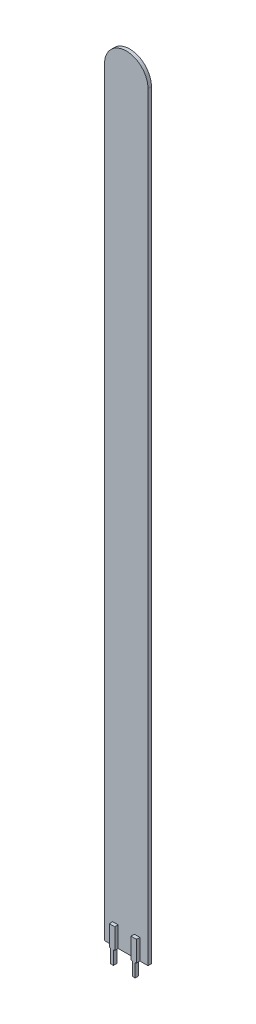
ISO-10303-21;
HEADER;
FILE_DESCRIPTION(('STEP AP214'),'2;1');
FILE_NAME('part.step','',(''),(''),'','','');
FILE_SCHEMA(('AUTOMOTIVE_DESIGN { 1 0 10303 214 1 1 1 1 }'));
ENDSEC;
DATA;
#1=APPLICATION_CONTEXT('core data for automotive mechanical design processes');
#2=APPLICATION_PROTOCOL_DEFINITION('international standard','automotive_design',2000,#1);
#3=PRODUCT_CONTEXT('',#1,'mechanical');
#4=PRODUCT('Part','Part','',(#3));
#5=PRODUCT_RELATED_PRODUCT_CATEGORY('part','',(#4));
#6=PRODUCT_DEFINITION_FORMATION('','',#4);
#7=PRODUCT_DEFINITION_CONTEXT('part definition',#1,'design');
#8=PRODUCT_DEFINITION('design','',#6,#7);
#9=PRODUCT_DEFINITION_SHAPE('','',#8);
#10=(LENGTH_UNIT() NAMED_UNIT(*) SI_UNIT(.MILLI.,.METRE.));
#11=(NAMED_UNIT(*) PLANE_ANGLE_UNIT() SI_UNIT($,.RADIAN.));
#12=(NAMED_UNIT(*) SI_UNIT($,.STERADIAN.) SOLID_ANGLE_UNIT());
#13=UNCERTAINTY_MEASURE_WITH_UNIT(LENGTH_MEASURE(1.E-05),#10,'distance_accuracy_value','');
#14=(GEOMETRIC_REPRESENTATION_CONTEXT(3) GLOBAL_UNCERTAINTY_ASSIGNED_CONTEXT((#13)) GLOBAL_UNIT_ASSIGNED_CONTEXT((#10,
#11,#12)) REPRESENTATION_CONTEXT('',''));
#15=CARTESIAN_POINT('',(0.,0.,0.));
#16=DIRECTION('',(0.,0.,1.));
#17=DIRECTION('',(1.,0.,0.));
#18=AXIS2_PLACEMENT_3D('',#15,#16,#17);
#19=CARTESIAN_POINT('',(0.,53.975,0.25));
#20=DIRECTION('',(0.,0.,1.));
#21=DIRECTION('',(1.,0.,0.));
#22=AXIS2_PLACEMENT_3D('',#19,#20,#21);
#23=PLANE('',#22);
#24=DIRECTION('',(1.,0.,0.));
#25=VECTOR('',#24,1.);
#26=CARTESIAN_POINT('',(3.175,-57.15,0.25));
#27=LINE('',#26,#25);
#28=CARTESIAN_POINT('',(-1.1875,-57.15,0.25));
#29=VERTEX_POINT('',#28);
#30=CARTESIAN_POINT('',(1.1875,-57.15,0.25));
#31=VERTEX_POINT('',#30);
#32=EDGE_CURVE('E474',#29,#31,#27,.T.);
#33=ORIENTED_EDGE('',*,*,#32,.T.);
#34=DIRECTION('',(0.,-1.,0.));
#35=VECTOR('',#34,1.);
#36=CARTESIAN_POINT('',(1.18749999999999,0.,0.25));
#37=LINE('',#36,#35);
#38=CARTESIAN_POINT('',(1.1875,-54.15,0.25));
#39=VERTEX_POINT('',#38);
#40=EDGE_CURVE('E70',#39,#31,#37,.T.);
#41=ORIENTED_EDGE('',*,*,#40,.F.);
#42=DIRECTION('',(-1.,0.,0.));
#43=VECTOR('',#42,1.);
#44=CARTESIAN_POINT('',(0.,-54.15,0.25));
#45=LINE('',#44,#43);
#46=CARTESIAN_POINT('',(1.9875,-54.15,0.25));
#47=VERTEX_POINT('',#46);
#48=EDGE_CURVE('E65',#47,#39,#45,.T.);
#49=ORIENTED_EDGE('',*,*,#48,.F.);
#50=DIRECTION('',(0.,-1.,0.));
#51=VECTOR('',#50,1.);
#52=CARTESIAN_POINT('',(1.98750000000001,0.,0.25));
#53=LINE('',#52,#51);
#54=CARTESIAN_POINT('',(1.9875,-57.15,0.25));
#55=VERTEX_POINT('',#54);
#56=EDGE_CURVE('E286',#47,#55,#53,.T.);
#57=ORIENTED_EDGE('',*,*,#56,.T.);
#58=CARTESIAN_POINT('',(3.175,-57.15,0.25));
#59=VERTEX_POINT('',#58);
#60=EDGE_CURVE('E428',#55,#59,#27,.T.);
#61=ORIENTED_EDGE('',*,*,#60,.T.);
#62=DIRECTION('',(0.,1.,0.));
#63=VECTOR('',#62,1.);
#64=CARTESIAN_POINT('',(3.175,-57.15,0.25));
#65=LINE('',#64,#63);
#66=CARTESIAN_POINT('',(3.175,53.975,0.25));
#67=VERTEX_POINT('',#66);
#68=EDGE_CURVE('E417',#59,#67,#65,.T.);
#69=ORIENTED_EDGE('',*,*,#68,.T.);
#70=CARTESIAN_POINT('',(0.,53.975,0.25));
#71=DIRECTION('',(0.,0.,1.));
#72=DIRECTION('',(1.,0.,0.));
#73=AXIS2_PLACEMENT_3D('',#70,#71,#72);
#74=CIRCLE('',#73,3.175);
#75=CARTESIAN_POINT('',(-3.175,53.975,0.25));
#76=VERTEX_POINT('',#75);
#77=EDGE_CURVE('E421',#67,#76,#74,.T.);
#78=ORIENTED_EDGE('',*,*,#77,.T.);
#79=DIRECTION('',(0.,-1.,0.));
#80=VECTOR('',#79,1.);
#81=CARTESIAN_POINT('',(-3.175,-57.15,0.25));
#82=LINE('',#81,#80);
#83=CARTESIAN_POINT('',(-3.175,-57.15,0.25));
#84=VERTEX_POINT('',#83);
#85=EDGE_CURVE('E425',#76,#84,#82,.T.);
#86=ORIENTED_EDGE('',*,*,#85,.T.);
#87=CARTESIAN_POINT('',(-1.9875,-57.15,0.25));
#88=VERTEX_POINT('',#87);
#89=EDGE_CURVE('E429',#84,#88,#27,.T.);
#90=ORIENTED_EDGE('',*,*,#89,.T.);
#91=DIRECTION('',(0.,-1.,0.));
#92=VECTOR('',#91,1.);
#93=CARTESIAN_POINT('',(-1.98750000000001,0.,0.25));
#94=LINE('',#93,#92);
#95=CARTESIAN_POINT('',(-1.9875,-54.15,0.25));
#96=VERTEX_POINT('',#95);
#97=EDGE_CURVE('E361',#96,#88,#94,.T.);
#98=ORIENTED_EDGE('',*,*,#97,.F.);
#99=DIRECTION('',(1.,0.,0.));
#100=VECTOR('',#99,1.);
#101=CARTESIAN_POINT('',(0.,-54.15,0.25));
#102=LINE('',#101,#100);
#103=CARTESIAN_POINT('',(-1.1875,-54.15,0.25));
#104=VERTEX_POINT('',#103);
#105=EDGE_CURVE('E357',#96,#104,#102,.T.);
#106=ORIENTED_EDGE('',*,*,#105,.T.);
#107=DIRECTION('',(0.,-1.,0.));
#108=VECTOR('',#107,1.);
#109=CARTESIAN_POINT('',(-1.18749999999999,0.,0.25));
#110=LINE('',#109,#108);
#111=EDGE_CURVE('E229',#104,#29,#110,.T.);
#112=ORIENTED_EDGE('',*,*,#111,.T.);
#113=EDGE_LOOP('',(#33,#41,#49,#57,#61,#69,#78,#86,#90,#98,#106,#112));
#114=FACE_BOUND('',#113,.T.);
#115=ADVANCED_FACE('F49',(#114),#23,.T.);
#116=CARTESIAN_POINT('',(3.175,-57.15,0.25));
#117=DIRECTION('',(-1.,0.,0.));
#118=DIRECTION('',(0.,0.,1.));
#119=AXIS2_PLACEMENT_3D('',#116,#117,#118);
#120=PLANE('',#119);
#121=DIRECTION('',(0.,1.,0.));
#122=VECTOR('',#121,1.);
#123=CARTESIAN_POINT('',(3.175,-57.15,-0.25));
#124=LINE('',#123,#122);
#125=CARTESIAN_POINT('',(3.175,-57.15,-0.25));
#126=VERTEX_POINT('',#125);
#127=CARTESIAN_POINT('',(3.175,53.975,-0.25));
#128=VERTEX_POINT('',#127);
#129=EDGE_CURVE('E416',#126,#128,#124,.T.);
#130=ORIENTED_EDGE('',*,*,#129,.T.);
#131=DIRECTION('',(0.,0.,-1.));
#132=VECTOR('',#131,1.);
#133=CARTESIAN_POINT('',(3.175,53.975,0.25));
#134=LINE('',#133,#132);
#135=EDGE_CURVE('E11',#67,#128,#134,.T.);
#136=ORIENTED_EDGE('',*,*,#135,.F.);
#137=ORIENTED_EDGE('',*,*,#68,.F.);
#138=DIRECTION('',(0.,0.,-1.));
#139=VECTOR('',#138,1.);
#140=CARTESIAN_POINT('',(3.175,-57.15,0.25));
#141=LINE('',#140,#139);
#142=EDGE_CURVE('E433',#59,#126,#141,.T.);
#143=ORIENTED_EDGE('',*,*,#142,.T.);
#144=EDGE_LOOP('',(#130,#136,#137,#143));
#145=FACE_BOUND('',#144,.T.);
#146=ADVANCED_FACE('F51',(#145),#120,.F.);
#147=CARTESIAN_POINT('',(0.,53.975,0.25));
#148=DIRECTION('',(0.,0.,-1.));
#149=DIRECTION('',(-1.,0.,0.));
#150=AXIS2_PLACEMENT_3D('',#147,#148,#149);
#151=CYLINDRICAL_SURFACE('',#150,3.175);
#152=CARTESIAN_POINT('',(0.,53.975,-0.25));
#153=DIRECTION('',(0.,0.,1.));
#154=DIRECTION('',(1.,0.,0.));
#155=AXIS2_PLACEMENT_3D('',#152,#153,#154);
#156=CIRCLE('',#155,3.175);
#157=CARTESIAN_POINT('',(-3.175,53.975,-0.25));
#158=VERTEX_POINT('',#157);
#159=EDGE_CURVE('E438',#128,#158,#156,.T.);
#160=ORIENTED_EDGE('',*,*,#159,.T.);
#161=DIRECTION('',(0.,0.,-1.));
#162=VECTOR('',#161,1.);
#163=CARTESIAN_POINT('',(-3.175,53.975,0.25));
#164=LINE('',#163,#162);
#165=EDGE_CURVE('E58',#76,#158,#164,.T.);
#166=ORIENTED_EDGE('',*,*,#165,.F.);
#167=ORIENTED_EDGE('',*,*,#77,.F.);
#168=ORIENTED_EDGE('',*,*,#135,.T.);
#169=EDGE_LOOP('',(#160,#166,#167,#168));
#170=FACE_BOUND('',#169,.T.);
#171=ADVANCED_FACE('F536',(#170),#151,.T.);
#172=CARTESIAN_POINT('',(-3.175,-57.15,0.25));
#173=DIRECTION('',(1.,0.,0.));
#174=DIRECTION('',(0.,0.,-1.));
#175=AXIS2_PLACEMENT_3D('',#172,#173,#174);
#176=PLANE('',#175);
#177=DIRECTION('',(0.,-1.,0.));
#178=VECTOR('',#177,1.);
#179=CARTESIAN_POINT('',(-3.175,-57.15,-0.25));
#180=LINE('',#179,#178);
#181=CARTESIAN_POINT('',(-3.175,-57.15,-0.25));
#182=VERTEX_POINT('',#181);
#183=EDGE_CURVE('E441',#158,#182,#180,.T.);
#184=ORIENTED_EDGE('',*,*,#183,.T.);
#185=DIRECTION('',(0.,0.,-1.));
#186=VECTOR('',#185,1.);
#187=CARTESIAN_POINT('',(-3.175,-57.15,0.25));
#188=LINE('',#187,#186);
#189=EDGE_CURVE('E449',#84,#182,#188,.T.);
#190=ORIENTED_EDGE('',*,*,#189,.F.);
#191=ORIENTED_EDGE('',*,*,#85,.F.);
#192=ORIENTED_EDGE('',*,*,#165,.T.);
#193=EDGE_LOOP('',(#184,#190,#191,#192));
#194=FACE_BOUND('',#193,.T.);
#195=ADVANCED_FACE('F458',(#194),#176,.F.);
#196=CARTESIAN_POINT('',(3.175,-57.15,0.25));
#197=DIRECTION('',(0.,1.,0.));
#198=DIRECTION('',(0.,0.,1.));
#199=AXIS2_PLACEMENT_3D('',#196,#197,#198);
#200=PLANE('',#199);
#201=DIRECTION('',(1.,0.,0.));
#202=VECTOR('',#201,1.);
#203=CARTESIAN_POINT('',(3.175,-57.15,-0.25));
#204=LINE('',#203,#202);
#205=EDGE_CURVE('E422',#182,#126,#204,.T.);
#206=ORIENTED_EDGE('',*,*,#205,.T.);
#207=ORIENTED_EDGE('',*,*,#142,.F.);
#208=ORIENTED_EDGE('',*,*,#60,.F.);
#209=DIRECTION('',(0.,0.,-1.));
#210=VECTOR('',#209,1.);
#211=CARTESIAN_POINT('',(1.9875,-57.15,0.75));
#212=LINE('',#211,#210);
#213=CARTESIAN_POINT('',(1.9875,-57.15,0.75));
#214=VERTEX_POINT('',#213);
#215=EDGE_CURVE('E296',#214,#55,#212,.T.);
#216=ORIENTED_EDGE('',*,*,#215,.F.);
#217=DIRECTION('',(-1.,0.,0.));
#218=VECTOR('',#217,1.);
#219=CARTESIAN_POINT('',(0.,-57.15,0.75));
#220=LINE('',#219,#218);
#221=CARTESIAN_POINT('',(1.9375,-57.15,0.75));
#222=VERTEX_POINT('',#221);
#223=EDGE_CURVE('E238',#214,#222,#220,.T.);
#224=ORIENTED_EDGE('',*,*,#223,.T.);
#225=DIRECTION('',(0.,0.,-1.));
#226=VECTOR('',#225,1.);
#227=CARTESIAN_POINT('',(1.9375,-57.15,0.75));
#228=LINE('',#227,#226);
#229=CARTESIAN_POINT('',(1.9375,-57.15,0.25));
#230=VERTEX_POINT('',#229);
#231=EDGE_CURVE('E300',#222,#230,#228,.T.);
#232=ORIENTED_EDGE('',*,*,#231,.T.);
#233=CARTESIAN_POINT('',(1.2375,-57.15,0.25));
#234=VERTEX_POINT('',#233);
#235=EDGE_CURVE('E472',#234,#230,#27,.T.);
#236=ORIENTED_EDGE('',*,*,#235,.F.);
#237=DIRECTION('',(0.,0.,-1.));
#238=VECTOR('',#237,1.);
#239=CARTESIAN_POINT('',(1.2375,-57.15,0.75));
#240=LINE('',#239,#238);
#241=CARTESIAN_POINT('',(1.2375,-57.15,0.75));
#242=VERTEX_POINT('',#241);
#243=EDGE_CURVE('E230',#242,#234,#240,.T.);
#244=ORIENTED_EDGE('',*,*,#243,.F.);
#245=CARTESIAN_POINT('',(1.1875,-57.15,0.75));
#246=VERTEX_POINT('',#245);
#247=EDGE_CURVE('E214',#242,#246,#220,.T.);
#248=ORIENTED_EDGE('',*,*,#247,.T.);
#249=DIRECTION('',(0.,0.,-1.));
#250=VECTOR('',#249,1.);
#251=CARTESIAN_POINT('',(1.1875,-57.15,0.75));
#252=LINE('',#251,#250);
#253=EDGE_CURVE('E224',#246,#31,#252,.T.);
#254=ORIENTED_EDGE('',*,*,#253,.T.);
#255=ORIENTED_EDGE('',*,*,#32,.F.);
#256=DIRECTION('',(0.,0.,-1.));
#257=VECTOR('',#256,1.);
#258=CARTESIAN_POINT('',(-1.1875,-57.15,0.75));
#259=LINE('',#258,#257);
#260=CARTESIAN_POINT('',(-1.1875,-57.15,0.75));
#261=VERTEX_POINT('',#260);
#262=EDGE_CURVE('E383',#261,#29,#259,.T.);
#263=ORIENTED_EDGE('',*,*,#262,.F.);
#264=DIRECTION('',(1.,0.,0.));
#265=VECTOR('',#264,1.);
#266=CARTESIAN_POINT('',(0.,-57.15,0.75));
#267=LINE('',#266,#265);
#268=CARTESIAN_POINT('',(-1.2375,-57.15,0.75));
#269=VERTEX_POINT('',#268);
#270=EDGE_CURVE('E335',#269,#261,#267,.T.);
#271=ORIENTED_EDGE('',*,*,#270,.F.);
#272=DIRECTION('',(0.,0.,-1.));
#273=VECTOR('',#272,1.);
#274=CARTESIAN_POINT('',(-1.2375,-57.15,0.75));
#275=LINE('',#274,#273);
#276=CARTESIAN_POINT('',(-1.2375,-57.15,0.25));
#277=VERTEX_POINT('',#276);
#278=EDGE_CURVE('E386',#269,#277,#275,.T.);
#279=ORIENTED_EDGE('',*,*,#278,.T.);
#280=CARTESIAN_POINT('',(-1.9375,-57.15,0.25));
#281=VERTEX_POINT('',#280);
#282=EDGE_CURVE('E434',#281,#277,#27,.T.);
#283=ORIENTED_EDGE('',*,*,#282,.F.);
#284=DIRECTION('',(0.,0.,-1.));
#285=VECTOR('',#284,1.);
#286=CARTESIAN_POINT('',(-1.9375,-57.15,0.75));
#287=LINE('',#286,#285);
#288=CARTESIAN_POINT('',(-1.9375,-57.15,0.75));
#289=VERTEX_POINT('',#288);
#290=EDGE_CURVE('E402',#289,#281,#287,.T.);
#291=ORIENTED_EDGE('',*,*,#290,.F.);
#292=CARTESIAN_POINT('',(-1.9875,-57.15,0.75));
#293=VERTEX_POINT('',#292);
#294=EDGE_CURVE('E331',#293,#289,#267,.T.);
#295=ORIENTED_EDGE('',*,*,#294,.F.);
#296=DIRECTION('',(0.,0.,-1.));
#297=VECTOR('',#296,1.);
#298=CARTESIAN_POINT('',(-1.9875,-57.15,0.75));
#299=LINE('',#298,#297);
#300=EDGE_CURVE('E405',#293,#88,#299,.T.);
#301=ORIENTED_EDGE('',*,*,#300,.T.);
#302=ORIENTED_EDGE('',*,*,#89,.F.);
#303=ORIENTED_EDGE('',*,*,#189,.T.);
#304=EDGE_LOOP('',(#206,#207,#208,#216,#224,#232,#236,#244,#248,#254,#255,#263,#271,#279,#283,
#291,#295,#301,#302,#303));
#305=FACE_BOUND('',#304,.T.);
#306=ADVANCED_FACE('F232',(#305),#200,.F.);
#307=CARTESIAN_POINT('',(0.,53.975,-0.25));
#308=DIRECTION('',(0.,0.,1.));
#309=DIRECTION('',(1.,0.,0.));
#310=AXIS2_PLACEMENT_3D('',#307,#308,#309);
#311=PLANE('',#310);
#312=ORIENTED_EDGE('',*,*,#129,.F.);
#313=ORIENTED_EDGE('',*,*,#205,.F.);
#314=ORIENTED_EDGE('',*,*,#183,.F.);
#315=ORIENTED_EDGE('',*,*,#159,.F.);
#316=EDGE_LOOP('',(#312,#313,#314,#315));
#317=FACE_BOUND('',#316,.T.);
#318=ADVANCED_FACE('F464',(#317),#311,.F.);
#319=CARTESIAN_POINT('',(0.,0.,0.25));
#320=DIRECTION('',(0.,0.,1.));
#321=DIRECTION('',(1.,0.,0.));
#322=AXIS2_PLACEMENT_3D('',#319,#320,#321);
#323=PLANE('',#322);
#324=CARTESIAN_POINT('',(-1.9375,-57.3,0.25));
#325=DIRECTION('',(0.,0.,1.));
#326=DIRECTION('',(1.,0.,0.));
#327=AXIS2_PLACEMENT_3D('',#324,#325,#326);
#328=CIRCLE('',#327,0.149999999999999);
#329=CARTESIAN_POINT('',(-1.7875,-57.3,0.25));
#330=VERTEX_POINT('',#329);
#331=EDGE_CURVE('E364',#330,#281,#328,.T.);
#332=ORIENTED_EDGE('',*,*,#331,.T.);
#333=ORIENTED_EDGE('',*,*,#282,.T.);
#334=CARTESIAN_POINT('',(-1.2375,-57.3,0.25));
#335=DIRECTION('',(0.,0.,1.));
#336=DIRECTION('',(1.,0.,0.));
#337=AXIS2_PLACEMENT_3D('',#334,#335,#336);
#338=CIRCLE('',#337,0.149999999999999);
#339=CARTESIAN_POINT('',(-1.3875,-57.3,0.25));
#340=VERTEX_POINT('',#339);
#341=EDGE_CURVE('E324',#277,#340,#338,.T.);
#342=ORIENTED_EDGE('',*,*,#341,.T.);
#343=DIRECTION('',(0.,-1.,0.));
#344=VECTOR('',#343,1.);
#345=CARTESIAN_POINT('',(-1.38749999999999,0.,0.25));
#346=LINE('',#345,#344);
#347=CARTESIAN_POINT('',(-1.3875,-59.15,0.25));
#348=VERTEX_POINT('',#347);
#349=EDGE_CURVE('E376',#340,#348,#346,.T.);
#350=ORIENTED_EDGE('',*,*,#349,.T.);
#351=DIRECTION('',(-1.,0.,0.));
#352=VECTOR('',#351,1.);
#353=CARTESIAN_POINT('',(0.,-59.15,0.25));
#354=LINE('',#353,#352);
#355=CARTESIAN_POINT('',(-1.7875,-59.15,0.25));
#356=VERTEX_POINT('',#355);
#357=EDGE_CURVE('E372',#348,#356,#354,.T.);
#358=ORIENTED_EDGE('',*,*,#357,.T.);
#359=DIRECTION('',(0.,-1.,0.));
#360=VECTOR('',#359,1.);
#361=CARTESIAN_POINT('',(-1.78750000000001,0.,0.25));
#362=LINE('',#361,#360);
#363=EDGE_CURVE('E368',#330,#356,#362,.T.);
#364=ORIENTED_EDGE('',*,*,#363,.F.);
#365=EDGE_LOOP('',(#332,#333,#342,#350,#358,#364));
#366=FACE_BOUND('',#365,.T.);
#367=ADVANCED_FACE('F482',(#366),#323,.F.);
#368=CARTESIAN_POINT('',(-1.18749999999999,0.,0.75));
#369=DIRECTION('',(1.,0.,0.));
#370=DIRECTION('',(0.,1.,0.));
#371=AXIS2_PLACEMENT_3D('',#368,#369,#370);
#372=PLANE('',#371);
#373=ORIENTED_EDGE('',*,*,#111,.F.);
#374=DIRECTION('',(0.,0.,-1.));
#375=VECTOR('',#374,1.);
#376=CARTESIAN_POINT('',(-1.1875,-54.15,0.75));
#377=LINE('',#376,#375);
#378=CARTESIAN_POINT('',(-1.1875,-54.15,0.75));
#379=VERTEX_POINT('',#378);
#380=EDGE_CURVE('E412',#379,#104,#377,.T.);
#381=ORIENTED_EDGE('',*,*,#380,.F.);
#382=DIRECTION('',(0.,-1.,0.));
#383=VECTOR('',#382,1.);
#384=CARTESIAN_POINT('',(-1.18749999999999,0.,0.75));
#385=LINE('',#384,#383);
#386=EDGE_CURVE('E319',#379,#261,#385,.T.);
#387=ORIENTED_EDGE('',*,*,#386,.T.);
#388=ORIENTED_EDGE('',*,*,#262,.T.);
#389=EDGE_LOOP('',(#373,#381,#387,#388));
#390=FACE_BOUND('',#389,.T.);
#391=ADVANCED_FACE('F521',(#390),#372,.T.);
#392=CARTESIAN_POINT('',(0.,-54.15,0.75));
#393=DIRECTION('',(0.,1.,0.));
#394=DIRECTION('',(0.,0.,1.));
#395=AXIS2_PLACEMENT_3D('',#392,#393,#394);
#396=PLANE('',#395);
#397=ORIENTED_EDGE('',*,*,#105,.F.);
#398=DIRECTION('',(0.,0.,-1.));
#399=VECTOR('',#398,1.);
#400=CARTESIAN_POINT('',(-1.9875,-54.15,0.75));
#401=LINE('',#400,#399);
#402=CARTESIAN_POINT('',(-1.9875,-54.15,0.75));
#403=VERTEX_POINT('',#402);
#404=EDGE_CURVE('E409',#403,#96,#401,.T.);
#405=ORIENTED_EDGE('',*,*,#404,.F.);
#406=DIRECTION('',(1.,0.,0.));
#407=VECTOR('',#406,1.);
#408=CARTESIAN_POINT('',(0.,-54.15,0.75));
#409=LINE('',#408,#407);
#410=EDGE_CURVE('E323',#403,#379,#409,.T.);
#411=ORIENTED_EDGE('',*,*,#410,.T.);
#412=ORIENTED_EDGE('',*,*,#380,.T.);
#413=EDGE_LOOP('',(#397,#405,#411,#412));
#414=FACE_BOUND('',#413,.T.);
#415=ADVANCED_FACE('F519',(#414),#396,.T.);
#416=CARTESIAN_POINT('',(-1.98750000000001,0.,0.75));
#417=DIRECTION('',(1.,0.,0.));
#418=DIRECTION('',(0.,1.,0.));
#419=AXIS2_PLACEMENT_3D('',#416,#417,#418);
#420=PLANE('',#419);
#421=ORIENTED_EDGE('',*,*,#97,.T.);
#422=ORIENTED_EDGE('',*,*,#300,.F.);
#423=DIRECTION('',(0.,-1.,0.));
#424=VECTOR('',#423,1.);
#425=CARTESIAN_POINT('',(-1.98750000000001,0.,0.75));
#426=LINE('',#425,#424);
#427=EDGE_CURVE('E328',#403,#293,#426,.T.);
#428=ORIENTED_EDGE('',*,*,#427,.F.);
#429=ORIENTED_EDGE('',*,*,#404,.T.);
#430=EDGE_LOOP('',(#421,#422,#428,#429));
#431=FACE_BOUND('',#430,.T.);
#432=ADVANCED_FACE('F515',(#431),#420,.F.);
#433=CARTESIAN_POINT('',(-1.9375,-57.3,0.75));
#434=DIRECTION('',(0.,0.,-1.));
#435=DIRECTION('',(-1.,0.,0.));
#436=AXIS2_PLACEMENT_3D('',#433,#434,#435);
#437=CYLINDRICAL_SURFACE('',#436,0.149999999999999);
#438=ORIENTED_EDGE('',*,*,#331,.F.);
#439=DIRECTION('',(0.,0.,-1.));
#440=VECTOR('',#439,1.);
#441=CARTESIAN_POINT('',(-1.7875,-57.3,0.75));
#442=LINE('',#441,#440);
#443=CARTESIAN_POINT('',(-1.7875,-57.3,0.75));
#444=VERTEX_POINT('',#443);
#445=EDGE_CURVE('E399',#444,#330,#442,.T.);
#446=ORIENTED_EDGE('',*,*,#445,.F.);
#447=CARTESIAN_POINT('',(-1.9375,-57.3,0.75));
#448=DIRECTION('',(0.,0.,1.));
#449=DIRECTION('',(1.,0.,0.));
#450=AXIS2_PLACEMENT_3D('',#447,#448,#449);
#451=CIRCLE('',#450,0.149999999999999);
#452=EDGE_CURVE('E334',#444,#289,#451,.T.);
#453=ORIENTED_EDGE('',*,*,#452,.T.);
#454=ORIENTED_EDGE('',*,*,#290,.T.);
#455=EDGE_LOOP('',(#438,#446,#453,#454));
#456=FACE_BOUND('',#455,.T.);
#457=ADVANCED_FACE('F506',(#456),#437,.F.);
#458=CARTESIAN_POINT('',(-1.78750000000001,0.,0.75));
#459=DIRECTION('',(1.,0.,0.));
#460=DIRECTION('',(0.,1.,0.));
#461=AXIS2_PLACEMENT_3D('',#458,#459,#460);
#462=PLANE('',#461);
#463=ORIENTED_EDGE('',*,*,#363,.T.);
#464=DIRECTION('',(0.,0.,-1.));
#465=VECTOR('',#464,1.);
#466=CARTESIAN_POINT('',(-1.7875,-59.15,0.75));
#467=LINE('',#466,#465);
#468=CARTESIAN_POINT('',(-1.7875,-59.15,0.75));
#469=VERTEX_POINT('',#468);
#470=EDGE_CURVE('E396',#469,#356,#467,.T.);
#471=ORIENTED_EDGE('',*,*,#470,.F.);
#472=DIRECTION('',(0.,-1.,0.));
#473=VECTOR('',#472,1.);
#474=CARTESIAN_POINT('',(-1.78750000000001,0.,0.75));
#475=LINE('',#474,#473);
#476=EDGE_CURVE('E339',#444,#469,#475,.T.);
#477=ORIENTED_EDGE('',*,*,#476,.F.);
#478=ORIENTED_EDGE('',*,*,#445,.T.);
#479=EDGE_LOOP('',(#463,#471,#477,#478));
#480=FACE_BOUND('',#479,.T.);
#481=ADVANCED_FACE('F503',(#480),#462,.F.);
#482=CARTESIAN_POINT('',(0.,-59.15,0.75));
#483=DIRECTION('',(0.,-1.,0.));
#484=DIRECTION('',(0.,0.,-1.));
#485=AXIS2_PLACEMENT_3D('',#482,#483,#484);
#486=PLANE('',#485);
#487=ORIENTED_EDGE('',*,*,#357,.F.);
#488=DIRECTION('',(0.,0.,-1.));
#489=VECTOR('',#488,1.);
#490=CARTESIAN_POINT('',(-1.3875,-59.15,0.75));
#491=LINE('',#490,#489);
#492=CARTESIAN_POINT('',(-1.3875,-59.15,0.75));
#493=VERTEX_POINT('',#492);
#494=EDGE_CURVE('E393',#493,#348,#491,.T.);
#495=ORIENTED_EDGE('',*,*,#494,.F.);
#496=DIRECTION('',(-1.,0.,0.));
#497=VECTOR('',#496,1.);
#498=CARTESIAN_POINT('',(0.,-59.15,0.75));
#499=LINE('',#498,#497);
#500=EDGE_CURVE('E342',#493,#469,#499,.T.);
#501=ORIENTED_EDGE('',*,*,#500,.T.);
#502=ORIENTED_EDGE('',*,*,#470,.T.);
#503=EDGE_LOOP('',(#487,#495,#501,#502));
#504=FACE_BOUND('',#503,.T.);
#505=ADVANCED_FACE('F498',(#504),#486,.T.);
#506=CARTESIAN_POINT('',(-1.38749999999999,0.,0.75));
#507=DIRECTION('',(1.,0.,0.));
#508=DIRECTION('',(0.,1.,0.));
#509=AXIS2_PLACEMENT_3D('',#506,#507,#508);
#510=PLANE('',#509);
#511=ORIENTED_EDGE('',*,*,#349,.F.);
#512=DIRECTION('',(0.,0.,-1.));
#513=VECTOR('',#512,1.);
#514=CARTESIAN_POINT('',(-1.3875,-57.3,0.75));
#515=LINE('',#514,#513);
#516=CARTESIAN_POINT('',(-1.3875,-57.3,0.75));
#517=VERTEX_POINT('',#516);
#518=EDGE_CURVE('E390',#517,#340,#515,.T.);
#519=ORIENTED_EDGE('',*,*,#518,.F.);
#520=DIRECTION('',(0.,-1.,0.));
#521=VECTOR('',#520,1.);
#522=CARTESIAN_POINT('',(-1.38749999999999,0.,0.75));
#523=LINE('',#522,#521);
#524=EDGE_CURVE('E346',#517,#493,#523,.T.);
#525=ORIENTED_EDGE('',*,*,#524,.T.);
#526=ORIENTED_EDGE('',*,*,#494,.T.);
#527=EDGE_LOOP('',(#511,#519,#525,#526));
#528=FACE_BOUND('',#527,.T.);
#529=ADVANCED_FACE('F495',(#528),#510,.T.);
#530=CARTESIAN_POINT('',(-1.2375,-57.3,0.75));
#531=DIRECTION('',(0.,0.,-1.));
#532=DIRECTION('',(-1.,0.,0.));
#533=AXIS2_PLACEMENT_3D('',#530,#531,#532);
#534=CYLINDRICAL_SURFACE('',#533,0.149999999999999);
#535=ORIENTED_EDGE('',*,*,#341,.F.);
#536=ORIENTED_EDGE('',*,*,#278,.F.);
#537=CARTESIAN_POINT('',(-1.2375,-57.3,0.75));
#538=DIRECTION('',(0.,0.,1.));
#539=DIRECTION('',(1.,0.,0.));
#540=AXIS2_PLACEMENT_3D('',#537,#538,#539);
#541=CIRCLE('',#540,0.149999999999999);
#542=EDGE_CURVE('E350',#269,#517,#541,.T.);
#543=ORIENTED_EDGE('',*,*,#542,.T.);
#544=ORIENTED_EDGE('',*,*,#518,.T.);
#545=EDGE_LOOP('',(#535,#536,#543,#544));
#546=FACE_BOUND('',#545,.T.);
#547=ADVANCED_FACE('F491',(#546),#534,.F.);
#548=CARTESIAN_POINT('',(0.,0.,0.75));
#549=DIRECTION('',(0.,0.,1.));
#550=DIRECTION('',(1.,0.,0.));
#551=AXIS2_PLACEMENT_3D('',#548,#549,#550);
#552=PLANE('',#551);
#553=ORIENTED_EDGE('',*,*,#386,.F.);
#554=ORIENTED_EDGE('',*,*,#410,.F.);
#555=ORIENTED_EDGE('',*,*,#427,.T.);
#556=ORIENTED_EDGE('',*,*,#294,.T.);
#557=ORIENTED_EDGE('',*,*,#452,.F.);
#558=ORIENTED_EDGE('',*,*,#476,.T.);
#559=ORIENTED_EDGE('',*,*,#500,.F.);
#560=ORIENTED_EDGE('',*,*,#524,.F.);
#561=ORIENTED_EDGE('',*,*,#542,.F.);
#562=ORIENTED_EDGE('',*,*,#270,.T.);
#563=EDGE_LOOP('',(#553,#554,#555,#556,#557,#558,#559,#560,#561,#562));
#564=FACE_BOUND('',#563,.T.);
#565=ADVANCED_FACE('F511',(#564),#552,.T.);
#566=CARTESIAN_POINT('',(0.,0.,0.25));
#567=DIRECTION('',(0.,0.,1.));
#568=DIRECTION('',(-1.,0.,0.));
#569=AXIS2_PLACEMENT_3D('',#566,#567,#568);
#570=PLANE('',#569);
#571=CARTESIAN_POINT('',(1.2375,-57.3,0.25));
#572=DIRECTION('',(0.,0.,-1.));
#573=DIRECTION('',(-1.,0.,0.));
#574=AXIS2_PLACEMENT_3D('',#571,#572,#573);
#575=CIRCLE('',#574,0.149999999999999);
#576=CARTESIAN_POINT('',(1.3875,-57.3,0.25));
#577=VERTEX_POINT('',#576);
#578=EDGE_CURVE('E268',#234,#577,#575,.T.);
#579=ORIENTED_EDGE('',*,*,#578,.F.);
#580=ORIENTED_EDGE('',*,*,#235,.T.);
#581=CARTESIAN_POINT('',(1.9375,-57.3,0.25));
#582=DIRECTION('',(0.,0.,-1.));
#583=DIRECTION('',(-1.,0.,0.));
#584=AXIS2_PLACEMENT_3D('',#581,#582,#583);
#585=CIRCLE('',#584,0.149999999999999);
#586=CARTESIAN_POINT('',(1.7875,-57.3,0.25));
#587=VERTEX_POINT('',#586);
#588=EDGE_CURVE('E282',#587,#230,#585,.T.);
#589=ORIENTED_EDGE('',*,*,#588,.F.);
#590=DIRECTION('',(0.,-1.,0.));
#591=VECTOR('',#590,1.);
#592=CARTESIAN_POINT('',(1.78750000000001,0.,0.25));
#593=LINE('',#592,#591);
#594=CARTESIAN_POINT('',(1.7875,-59.15,0.25));
#595=VERTEX_POINT('',#594);
#596=EDGE_CURVE('E278',#587,#595,#593,.T.);
#597=ORIENTED_EDGE('',*,*,#596,.T.);
#598=DIRECTION('',(1.,0.,0.));
#599=VECTOR('',#598,1.);
#600=CARTESIAN_POINT('',(0.,-59.15,0.25));
#601=LINE('',#600,#599);
#602=CARTESIAN_POINT('',(1.3875,-59.15,0.25));
#603=VERTEX_POINT('',#602);
#604=EDGE_CURVE('E274',#603,#595,#601,.T.);
#605=ORIENTED_EDGE('',*,*,#604,.F.);
#606=DIRECTION('',(0.,-1.,0.));
#607=VECTOR('',#606,1.);
#608=CARTESIAN_POINT('',(1.38749999999999,0.,0.25));
#609=LINE('',#608,#607);
#610=EDGE_CURVE('E271',#577,#603,#609,.T.);
#611=ORIENTED_EDGE('',*,*,#610,.F.);
#612=EDGE_LOOP('',(#579,#580,#589,#597,#605,#611));
#613=FACE_BOUND('',#612,.T.);
#614=ADVANCED_FACE('F631',(#613),#570,.F.);
#615=CARTESIAN_POINT('',(1.18749999999999,0.,0.75));
#616=DIRECTION('',(1.,0.,0.));
#617=DIRECTION('',(0.,1.,0.));
#618=AXIS2_PLACEMENT_3D('',#615,#616,#617);
#619=PLANE('',#618);
#620=ORIENTED_EDGE('',*,*,#40,.T.);
#621=ORIENTED_EDGE('',*,*,#253,.F.);
#622=DIRECTION('',(0.,-1.,0.));
#623=VECTOR('',#622,1.);
#624=CARTESIAN_POINT('',(1.18749999999999,0.,0.75));
#625=LINE('',#624,#623);
#626=CARTESIAN_POINT('',(1.1875,-54.15,0.75));
#627=VERTEX_POINT('',#626);
#628=EDGE_CURVE('E210',#627,#246,#625,.T.);
#629=ORIENTED_EDGE('',*,*,#628,.F.);
#630=DIRECTION('',(0.,0.,-1.));
#631=VECTOR('',#630,1.);
#632=CARTESIAN_POINT('',(1.1875,-54.15,0.75));
#633=LINE('',#632,#631);
#634=EDGE_CURVE('E265',#627,#39,#633,.T.);
#635=ORIENTED_EDGE('',*,*,#634,.T.);
#636=EDGE_LOOP('',(#620,#621,#629,#635));
#637=FACE_BOUND('',#636,.T.);
#638=ADVANCED_FACE('F225',(#637),#619,.F.);
#639=CARTESIAN_POINT('',(1.2375,-57.3,0.75));
#640=DIRECTION('',(0.,0.,-1.));
#641=DIRECTION('',(-1.,0.,0.));
#642=AXIS2_PLACEMENT_3D('',#639,#640,#641);
#643=CYLINDRICAL_SURFACE('',#642,0.149999999999999);
#644=ORIENTED_EDGE('',*,*,#578,.T.);
#645=DIRECTION('',(0.,0.,-1.));
#646=VECTOR('',#645,1.);
#647=CARTESIAN_POINT('',(1.3875,-57.3,0.75));
#648=LINE('',#647,#646);
#649=CARTESIAN_POINT('',(1.3875,-57.3,0.75));
#650=VERTEX_POINT('',#649);
#651=EDGE_CURVE('E313',#650,#577,#648,.T.);
#652=ORIENTED_EDGE('',*,*,#651,.F.);
#653=CARTESIAN_POINT('',(1.2375,-57.3,0.75));
#654=DIRECTION('',(0.,0.,-1.));
#655=DIRECTION('',(-1.,0.,0.));
#656=AXIS2_PLACEMENT_3D('',#653,#654,#655);
#657=CIRCLE('',#656,0.149999999999999);
#658=EDGE_CURVE('E236',#242,#650,#657,.T.);
#659=ORIENTED_EDGE('',*,*,#658,.F.);
#660=ORIENTED_EDGE('',*,*,#243,.T.);
#661=EDGE_LOOP('',(#644,#652,#659,#660));
#662=FACE_BOUND('',#661,.T.);
#663=ADVANCED_FACE('F649',(#662),#643,.F.);
#664=CARTESIAN_POINT('',(1.38749999999999,0.,0.75));
#665=DIRECTION('',(1.,0.,0.));
#666=DIRECTION('',(0.,1.,0.));
#667=AXIS2_PLACEMENT_3D('',#664,#665,#666);
#668=PLANE('',#667);
#669=ORIENTED_EDGE('',*,*,#610,.T.);
#670=DIRECTION('',(0.,0.,-1.));
#671=VECTOR('',#670,1.);
#672=CARTESIAN_POINT('',(1.3875,-59.15,0.75));
#673=LINE('',#672,#671);
#674=CARTESIAN_POINT('',(1.3875,-59.15,0.75));
#675=VERTEX_POINT('',#674);
#676=EDGE_CURVE('E309',#675,#603,#673,.T.);
#677=ORIENTED_EDGE('',*,*,#676,.F.);
#678=DIRECTION('',(0.,-1.,0.));
#679=VECTOR('',#678,1.);
#680=CARTESIAN_POINT('',(1.38749999999999,0.,0.75));
#681=LINE('',#680,#679);
#682=EDGE_CURVE('E240',#650,#675,#681,.T.);
#683=ORIENTED_EDGE('',*,*,#682,.F.);
#684=ORIENTED_EDGE('',*,*,#651,.T.);
#685=EDGE_LOOP('',(#669,#677,#683,#684));
#686=FACE_BOUND('',#685,.T.);
#687=ADVANCED_FACE('F658',(#686),#668,.F.);
#688=CARTESIAN_POINT('',(0.,-59.15,0.75));
#689=DIRECTION('',(0.,1.,0.));
#690=DIRECTION('',(0.,0.,1.));
#691=AXIS2_PLACEMENT_3D('',#688,#689,#690);
#692=PLANE('',#691);
#693=ORIENTED_EDGE('',*,*,#604,.T.);
#694=DIRECTION('',(0.,0.,-1.));
#695=VECTOR('',#694,1.);
#696=CARTESIAN_POINT('',(1.7875,-59.15,0.75));
#697=LINE('',#696,#695);
#698=CARTESIAN_POINT('',(1.7875,-59.15,0.75));
#699=VERTEX_POINT('',#698);
#700=EDGE_CURVE('E306',#699,#595,#697,.T.);
#701=ORIENTED_EDGE('',*,*,#700,.F.);
#702=DIRECTION('',(1.,0.,0.));
#703=VECTOR('',#702,1.);
#704=CARTESIAN_POINT('',(0.,-59.15,0.75));
#705=LINE('',#704,#703);
#706=EDGE_CURVE('E259',#675,#699,#705,.T.);
#707=ORIENTED_EDGE('',*,*,#706,.F.);
#708=ORIENTED_EDGE('',*,*,#676,.T.);
#709=EDGE_LOOP('',(#693,#701,#707,#708));
#710=FACE_BOUND('',#709,.T.);
#711=ADVANCED_FACE('F668',(#710),#692,.F.);
#712=CARTESIAN_POINT('',(1.78750000000001,0.,0.75));
#713=DIRECTION('',(1.,0.,0.));
#714=DIRECTION('',(0.,1.,0.));
#715=AXIS2_PLACEMENT_3D('',#712,#713,#714);
#716=PLANE('',#715);
#717=ORIENTED_EDGE('',*,*,#596,.F.);
#718=DIRECTION('',(0.,0.,-1.));
#719=VECTOR('',#718,1.);
#720=CARTESIAN_POINT('',(1.7875,-57.3,0.75));
#721=LINE('',#720,#719);
#722=CARTESIAN_POINT('',(1.7875,-57.3,0.75));
#723=VERTEX_POINT('',#722);
#724=EDGE_CURVE('E303',#723,#587,#721,.T.);
#725=ORIENTED_EDGE('',*,*,#724,.F.);
#726=DIRECTION('',(0.,-1.,0.));
#727=VECTOR('',#726,1.);
#728=CARTESIAN_POINT('',(1.78750000000001,0.,0.75));
#729=LINE('',#728,#727);
#730=EDGE_CURVE('E252',#723,#699,#729,.T.);
#731=ORIENTED_EDGE('',*,*,#730,.T.);
#732=ORIENTED_EDGE('',*,*,#700,.T.);
#733=EDGE_LOOP('',(#717,#725,#731,#732));
#734=FACE_BOUND('',#733,.T.);
#735=ADVANCED_FACE('F678',(#734),#716,.T.);
#736=CARTESIAN_POINT('',(1.9375,-57.3,0.75));
#737=DIRECTION('',(0.,0.,-1.));
#738=DIRECTION('',(-1.,0.,0.));
#739=AXIS2_PLACEMENT_3D('',#736,#737,#738);
#740=CYLINDRICAL_SURFACE('',#739,0.149999999999999);
#741=ORIENTED_EDGE('',*,*,#588,.T.);
#742=ORIENTED_EDGE('',*,*,#231,.F.);
#743=CARTESIAN_POINT('',(1.9375,-57.3,0.75));
#744=DIRECTION('',(0.,0.,-1.));
#745=DIRECTION('',(-1.,0.,0.));
#746=AXIS2_PLACEMENT_3D('',#743,#744,#745);
#747=CIRCLE('',#746,0.149999999999999);
#748=EDGE_CURVE('E245',#723,#222,#747,.T.);
#749=ORIENTED_EDGE('',*,*,#748,.F.);
#750=ORIENTED_EDGE('',*,*,#724,.T.);
#751=EDGE_LOOP('',(#741,#742,#749,#750));
#752=FACE_BOUND('',#751,.T.);
#753=ADVANCED_FACE('F688',(#752),#740,.F.);
#754=CARTESIAN_POINT('',(1.98750000000001,0.,0.75));
#755=DIRECTION('',(1.,0.,0.));
#756=DIRECTION('',(0.,1.,0.));
#757=AXIS2_PLACEMENT_3D('',#754,#755,#756);
#758=PLANE('',#757);
#759=ORIENTED_EDGE('',*,*,#56,.F.);
#760=DIRECTION('',(0.,0.,-1.));
#761=VECTOR('',#760,1.);
#762=CARTESIAN_POINT('',(1.9875,-54.15,0.75));
#763=LINE('',#762,#761);
#764=CARTESIAN_POINT('',(1.9875,-54.15,0.75));
#765=VERTEX_POINT('',#764);
#766=EDGE_CURVE('E293',#765,#47,#763,.T.);
#767=ORIENTED_EDGE('',*,*,#766,.F.);
#768=DIRECTION('',(0.,-1.,0.));
#769=VECTOR('',#768,1.);
#770=CARTESIAN_POINT('',(1.98750000000001,0.,0.75));
#771=LINE('',#770,#769);
#772=EDGE_CURVE('E244',#765,#214,#771,.T.);
#773=ORIENTED_EDGE('',*,*,#772,.T.);
#774=ORIENTED_EDGE('',*,*,#215,.T.);
#775=EDGE_LOOP('',(#759,#767,#773,#774));
#776=FACE_BOUND('',#775,.T.);
#777=ADVANCED_FACE('F698',(#776),#758,.T.);
#778=CARTESIAN_POINT('',(0.,-54.15,0.75));
#779=DIRECTION('',(0.,-1.,0.));
#780=DIRECTION('',(0.,0.,-1.));
#781=AXIS2_PLACEMENT_3D('',#778,#779,#780);
#782=PLANE('',#781);
#783=ORIENTED_EDGE('',*,*,#48,.T.);
#784=ORIENTED_EDGE('',*,*,#634,.F.);
#785=DIRECTION('',(-1.,0.,0.));
#786=VECTOR('',#785,1.);
#787=CARTESIAN_POINT('',(0.,-54.15,0.75));
#788=LINE('',#787,#786);
#789=EDGE_CURVE('E217',#765,#627,#788,.T.);
#790=ORIENTED_EDGE('',*,*,#789,.F.);
#791=ORIENTED_EDGE('',*,*,#766,.T.);
#792=EDGE_LOOP('',(#783,#784,#790,#791));
#793=FACE_BOUND('',#792,.T.);
#794=ADVANCED_FACE('F708',(#793),#782,.F.);
#795=CARTESIAN_POINT('',(0.,0.,0.75));
#796=DIRECTION('',(0.,0.,1.));
#797=DIRECTION('',(-1.,0.,0.));
#798=AXIS2_PLACEMENT_3D('',#795,#796,#797);
#799=PLANE('',#798);
#800=ORIENTED_EDGE('',*,*,#628,.T.);
#801=ORIENTED_EDGE('',*,*,#247,.F.);
#802=ORIENTED_EDGE('',*,*,#658,.T.);
#803=ORIENTED_EDGE('',*,*,#682,.T.);
#804=ORIENTED_EDGE('',*,*,#706,.T.);
#805=ORIENTED_EDGE('',*,*,#730,.F.);
#806=ORIENTED_EDGE('',*,*,#748,.T.);
#807=ORIENTED_EDGE('',*,*,#223,.F.);
#808=ORIENTED_EDGE('',*,*,#772,.F.);
#809=ORIENTED_EDGE('',*,*,#789,.T.);
#810=EDGE_LOOP('',(#800,#801,#802,#803,#804,#805,#806,#807,#808,#809));
#811=FACE_BOUND('',#810,.T.);
#812=ADVANCED_FACE('F212',(#811),#799,.T.);
#813=CLOSED_SHELL('',(#115,#146,#171,#195,#306,#318,#367,#391,#415,#432,#457,#481,#505,#529,
#547,#565,#614,#638,#663,#687,#711,#735,#753,#777,#794,#812));
#814=MANIFOLD_SOLID_BREP('B2',#813);
#815=ADVANCED_BREP_SHAPE_REPRESENTATION('',(#18,#814),#14);
#816=SHAPE_DEFINITION_REPRESENTATION(#9,#815);
ENDSEC;
END-ISO-10303-21;
